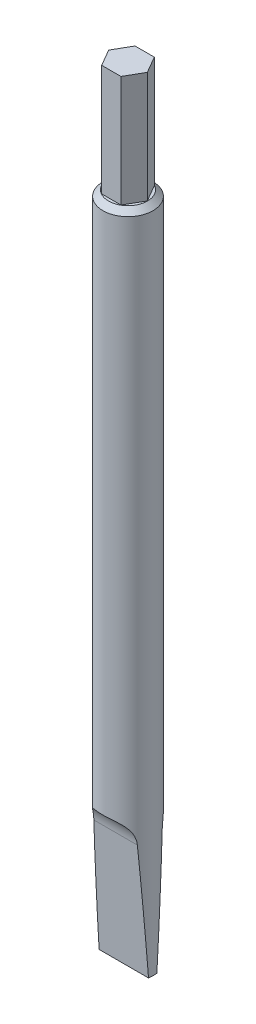
ISO-10303-21;
HEADER;
FILE_DESCRIPTION(('STEP AP214'),'2;1');
FILE_NAME('part.step','',(''),(''),'','','');
FILE_SCHEMA(('AUTOMOTIVE_DESIGN { 1 0 10303 214 1 1 1 1 }'));
ENDSEC;
DATA;
#1=APPLICATION_CONTEXT('core data for automotive mechanical design processes');
#2=APPLICATION_PROTOCOL_DEFINITION('international standard','automotive_design',2000,#1);
#3=PRODUCT_CONTEXT('',#1,'mechanical');
#4=PRODUCT('Part','Part','',(#3));
#5=PRODUCT_RELATED_PRODUCT_CATEGORY('part','',(#4));
#6=PRODUCT_DEFINITION_FORMATION('','',#4);
#7=PRODUCT_DEFINITION_CONTEXT('part definition',#1,'design');
#8=PRODUCT_DEFINITION('design','',#6,#7);
#9=PRODUCT_DEFINITION_SHAPE('','',#8);
#10=(LENGTH_UNIT() NAMED_UNIT(*) SI_UNIT(.MILLI.,.METRE.));
#11=(NAMED_UNIT(*) PLANE_ANGLE_UNIT() SI_UNIT($,.RADIAN.));
#12=(NAMED_UNIT(*) SI_UNIT($,.STERADIAN.) SOLID_ANGLE_UNIT());
#13=UNCERTAINTY_MEASURE_WITH_UNIT(LENGTH_MEASURE(1.E-05),#10,'distance_accuracy_value','');
#14=(GEOMETRIC_REPRESENTATION_CONTEXT(3) GLOBAL_UNCERTAINTY_ASSIGNED_CONTEXT((#13)) GLOBAL_UNIT_ASSIGNED_CONTEXT((#10,
#11,#12)) REPRESENTATION_CONTEXT('',''));
#15=CARTESIAN_POINT('',(0.,0.,0.));
#16=DIRECTION('',(0.,0.,1.));
#17=DIRECTION('',(1.,0.,0.));
#18=AXIS2_PLACEMENT_3D('',#15,#16,#17);
#19=CARTESIAN_POINT('',(-2.59807621135332,20.,-1.5));
#20=DIRECTION('',(-0.866025403784439,0.,-0.5));
#21=DIRECTION('',(-0.5,0.,0.866025403784439));
#22=AXIS2_PLACEMENT_3D('',#19,#20,#21);
#23=PLANE('',#22);
#24=DIRECTION('',(0.5,0.,-0.866025403784439));
#25=VECTOR('',#24,1.);
#26=CARTESIAN_POINT('',(-2.59807621135332,0.,-1.5));
#27=LINE('',#26,#25);
#28=CARTESIAN_POINT('',(-3.46410161513775,0.,0.));
#29=VERTEX_POINT('',#28);
#30=CARTESIAN_POINT('',(-1.73205080756888,0.,-3.));
#31=VERTEX_POINT('',#30);
#32=EDGE_CURVE('E159',#29,#31,#27,.T.);
#33=ORIENTED_EDGE('',*,*,#32,.F.);
#34=DIRECTION('',(0.,-1.,0.));
#35=VECTOR('',#34,1.);
#36=CARTESIAN_POINT('',(-3.46410161513775,20.,0.));
#37=LINE('',#36,#35);
#38=CARTESIAN_POINT('',(-3.46410161513775,20.,0.));
#39=VERTEX_POINT('',#38);
#40=EDGE_CURVE('E185',#39,#29,#37,.T.);
#41=ORIENTED_EDGE('',*,*,#40,.F.);
#42=DIRECTION('',(0.5,0.,-0.866025403784439));
#43=VECTOR('',#42,1.);
#44=CARTESIAN_POINT('',(-2.59807621135332,20.,-1.5));
#45=LINE('',#44,#43);
#46=CARTESIAN_POINT('',(-1.73205080756888,20.,-3.));
#47=VERTEX_POINT('',#46);
#48=EDGE_CURVE('E139',#39,#47,#45,.T.);
#49=ORIENTED_EDGE('',*,*,#48,.T.);
#50=DIRECTION('',(0.,-1.,0.));
#51=VECTOR('',#50,1.);
#52=CARTESIAN_POINT('',(-1.73205080756888,20.,-3.));
#53=LINE('',#52,#51);
#54=EDGE_CURVE('E158',#47,#31,#53,.T.);
#55=ORIENTED_EDGE('',*,*,#54,.T.);
#56=EDGE_LOOP('',(#33,#41,#49,#55));
#57=FACE_BOUND('',#56,.T.);
#58=ADVANCED_FACE('F34',(#57),#23,.T.);
#59=CARTESIAN_POINT('',(-2.59807621135332,20.,1.5));
#60=DIRECTION('',(-0.866025403784439,0.,0.5));
#61=DIRECTION('',(0.5,0.,0.866025403784439));
#62=AXIS2_PLACEMENT_3D('',#59,#60,#61);
#63=PLANE('',#62);
#64=DIRECTION('',(-0.5,0.,-0.866025403784439));
#65=VECTOR('',#64,1.);
#66=CARTESIAN_POINT('',(-2.59807621135332,0.,1.5));
#67=LINE('',#66,#65);
#68=CARTESIAN_POINT('',(-1.73205080756888,0.,3.));
#69=VERTEX_POINT('',#68);
#70=EDGE_CURVE('E162',#69,#29,#67,.T.);
#71=ORIENTED_EDGE('',*,*,#70,.F.);
#72=DIRECTION('',(0.,-1.,0.));
#73=VECTOR('',#72,1.);
#74=CARTESIAN_POINT('',(-1.73205080756888,20.,3.));
#75=LINE('',#74,#73);
#76=CARTESIAN_POINT('',(-1.73205080756888,20.,3.));
#77=VERTEX_POINT('',#76);
#78=EDGE_CURVE('E183',#77,#69,#75,.T.);
#79=ORIENTED_EDGE('',*,*,#78,.F.);
#80=DIRECTION('',(-0.5,0.,-0.866025403784439));
#81=VECTOR('',#80,1.);
#82=CARTESIAN_POINT('',(-2.59807621135332,20.,1.5));
#83=LINE('',#82,#81);
#84=EDGE_CURVE('E142',#77,#39,#83,.T.);
#85=ORIENTED_EDGE('',*,*,#84,.T.);
#86=ORIENTED_EDGE('',*,*,#40,.T.);
#87=EDGE_LOOP('',(#71,#79,#85,#86));
#88=FACE_BOUND('',#87,.T.);
#89=ADVANCED_FACE('F219',(#88),#63,.T.);
#90=CARTESIAN_POINT('',(0.,20.,3.));
#91=DIRECTION('',(0.,0.,1.));
#92=DIRECTION('',(1.,0.,0.));
#93=AXIS2_PLACEMENT_3D('',#90,#91,#92);
#94=PLANE('',#93);
#95=DIRECTION('',(-1.,0.,0.));
#96=VECTOR('',#95,1.);
#97=CARTESIAN_POINT('',(0.,0.,3.));
#98=LINE('',#97,#96);
#99=CARTESIAN_POINT('',(1.73205080756888,0.,3.));
#100=VERTEX_POINT('',#99);
#101=EDGE_CURVE('E165',#100,#69,#98,.T.);
#102=ORIENTED_EDGE('',*,*,#101,.F.);
#103=DIRECTION('',(0.,-1.,0.));
#104=VECTOR('',#103,1.);
#105=CARTESIAN_POINT('',(1.73205080756888,20.,3.));
#106=LINE('',#105,#104);
#107=CARTESIAN_POINT('',(1.73205080756888,20.,3.));
#108=VERTEX_POINT('',#107);
#109=EDGE_CURVE('E181',#108,#100,#106,.T.);
#110=ORIENTED_EDGE('',*,*,#109,.F.);
#111=DIRECTION('',(-1.,0.,0.));
#112=VECTOR('',#111,1.);
#113=CARTESIAN_POINT('',(0.,20.,3.));
#114=LINE('',#113,#112);
#115=EDGE_CURVE('E146',#108,#77,#114,.T.);
#116=ORIENTED_EDGE('',*,*,#115,.T.);
#117=ORIENTED_EDGE('',*,*,#78,.T.);
#118=EDGE_LOOP('',(#102,#110,#116,#117));
#119=FACE_BOUND('',#118,.T.);
#120=ADVANCED_FACE('F224',(#119),#94,.T.);
#121=CARTESIAN_POINT('',(2.59807621135332,20.,1.5));
#122=DIRECTION('',(0.866025403784439,0.,0.5));
#123=DIRECTION('',(0.5,0.,-0.866025403784439));
#124=AXIS2_PLACEMENT_3D('',#121,#122,#123);
#125=PLANE('',#124);
#126=DIRECTION('',(-0.5,0.,0.866025403784439));
#127=VECTOR('',#126,1.);
#128=CARTESIAN_POINT('',(2.59807621135332,0.,1.5));
#129=LINE('',#128,#127);
#130=CARTESIAN_POINT('',(3.46410161513776,0.,0.));
#131=VERTEX_POINT('',#130);
#132=EDGE_CURVE('E168',#131,#100,#129,.T.);
#133=ORIENTED_EDGE('',*,*,#132,.F.);
#134=DIRECTION('',(0.,-1.,0.));
#135=VECTOR('',#134,1.);
#136=CARTESIAN_POINT('',(3.46410161513776,20.,0.));
#137=LINE('',#136,#135);
#138=CARTESIAN_POINT('',(3.46410161513776,20.,0.));
#139=VERTEX_POINT('',#138);
#140=EDGE_CURVE('E179',#139,#131,#137,.T.);
#141=ORIENTED_EDGE('',*,*,#140,.F.);
#142=DIRECTION('',(-0.5,0.,0.866025403784439));
#143=VECTOR('',#142,1.);
#144=CARTESIAN_POINT('',(2.59807621135332,20.,1.5));
#145=LINE('',#144,#143);
#146=EDGE_CURVE('E149',#139,#108,#145,.T.);
#147=ORIENTED_EDGE('',*,*,#146,.T.);
#148=ORIENTED_EDGE('',*,*,#109,.T.);
#149=EDGE_LOOP('',(#133,#141,#147,#148));
#150=FACE_BOUND('',#149,.T.);
#151=ADVANCED_FACE('F230',(#150),#125,.T.);
#152=CARTESIAN_POINT('',(2.59807621135332,20.,-1.5));
#153=DIRECTION('',(0.866025403784439,0.,-0.5));
#154=DIRECTION('',(-0.5,0.,-0.866025403784439));
#155=AXIS2_PLACEMENT_3D('',#152,#153,#154);
#156=PLANE('',#155);
#157=DIRECTION('',(0.5,0.,0.866025403784439));
#158=VECTOR('',#157,1.);
#159=CARTESIAN_POINT('',(2.59807621135332,0.,-1.5));
#160=LINE('',#159,#158);
#161=CARTESIAN_POINT('',(1.73205080756888,0.,-3.));
#162=VERTEX_POINT('',#161);
#163=EDGE_CURVE('E171',#162,#131,#160,.T.);
#164=ORIENTED_EDGE('',*,*,#163,.F.);
#165=DIRECTION('',(0.,-1.,0.));
#166=VECTOR('',#165,1.);
#167=CARTESIAN_POINT('',(1.73205080756888,20.,-3.));
#168=LINE('',#167,#166);
#169=CARTESIAN_POINT('',(1.73205080756888,20.,-3.));
#170=VERTEX_POINT('',#169);
#171=EDGE_CURVE('E177',#170,#162,#168,.T.);
#172=ORIENTED_EDGE('',*,*,#171,.F.);
#173=DIRECTION('',(0.5,0.,0.866025403784439));
#174=VECTOR('',#173,1.);
#175=CARTESIAN_POINT('',(2.59807621135332,20.,-1.5));
#176=LINE('',#175,#174);
#177=EDGE_CURVE('E152',#170,#139,#176,.T.);
#178=ORIENTED_EDGE('',*,*,#177,.T.);
#179=ORIENTED_EDGE('',*,*,#140,.T.);
#180=EDGE_LOOP('',(#164,#172,#178,#179));
#181=FACE_BOUND('',#180,.T.);
#182=ADVANCED_FACE('F234',(#181),#156,.T.);
#183=CARTESIAN_POINT('',(0.,20.,-3.));
#184=DIRECTION('',(0.,0.,-1.));
#185=DIRECTION('',(-1.,0.,0.));
#186=AXIS2_PLACEMENT_3D('',#183,#184,#185);
#187=PLANE('',#186);
#188=DIRECTION('',(1.,0.,0.));
#189=VECTOR('',#188,1.);
#190=CARTESIAN_POINT('',(0.,0.,-3.));
#191=LINE('',#190,#189);
#192=EDGE_CURVE('E143',#31,#162,#191,.T.);
#193=ORIENTED_EDGE('',*,*,#192,.F.);
#194=ORIENTED_EDGE('',*,*,#54,.F.);
#195=DIRECTION('',(1.,0.,0.));
#196=VECTOR('',#195,1.);
#197=CARTESIAN_POINT('',(0.,20.,-3.));
#198=LINE('',#197,#196);
#199=EDGE_CURVE('E155',#47,#170,#198,.T.);
#200=ORIENTED_EDGE('',*,*,#199,.T.);
#201=ORIENTED_EDGE('',*,*,#171,.T.);
#202=EDGE_LOOP('',(#193,#194,#200,#201));
#203=FACE_BOUND('',#202,.T.);
#204=ADVANCED_FACE('F238',(#203),#187,.T.);
#205=CARTESIAN_POINT('',(0.,20.,0.));
#206=DIRECTION('',(0.,1.,0.));
#207=DIRECTION('',(0.,0.,1.));
#208=AXIS2_PLACEMENT_3D('',#205,#206,#207);
#209=PLANE('',#208);
#210=ORIENTED_EDGE('',*,*,#48,.F.);
#211=ORIENTED_EDGE('',*,*,#84,.F.);
#212=ORIENTED_EDGE('',*,*,#115,.F.);
#213=ORIENTED_EDGE('',*,*,#146,.F.);
#214=ORIENTED_EDGE('',*,*,#177,.F.);
#215=ORIENTED_EDGE('',*,*,#199,.F.);
#216=EDGE_LOOP('',(#210,#211,#212,#213,#214,#215));
#217=FACE_BOUND('',#216,.T.);
#218=ADVANCED_FACE('F241',(#217),#209,.T.);
#219=CARTESIAN_POINT('',(0.,-120.,0.));
#220=DIRECTION('',(0.,1.,0.));
#221=DIRECTION('',(0.,0.,1.));
#222=AXIS2_PLACEMENT_3D('',#219,#220,#221);
#223=CYLINDRICAL_SURFACE('',#222,4.5);
#224=CARTESIAN_POINT('',(0.,-130.725499692534,0.));
#225=DIRECTION('',(0.,0.0697564737441253,0.997564050259824));
#226=DIRECTION('',(0.,0.997564050259824,-0.0697564737441253));
#227=AXIS2_PLACEMENT_3D('',#224,#225,#226);
#228=ELLIPSE('',#227,64.5101416179165,4.5);
#229=CARTESIAN_POINT('',(3.90913794443008,-98.8486745427175,-2.22904475760738));
#230=VERTEX_POINT('',#229);
#231=CARTESIAN_POINT('',(4.43705983732471,-120.,-0.75));
#232=VERTEX_POINT('',#231);
#233=EDGE_CURVE('E62',#230,#232,#228,.F.);
#234=ORIENTED_EDGE('',*,*,#233,.F.);
#235=CARTESIAN_POINT('',(0.,-103.394913822876,-4.5));
#236=CARTESIAN_POINT('',(-0.10306936266592,-103.394914042659,-4.49999959992725));
#237=CARTESIAN_POINT('',(-0.206146526435707,-103.39262561122,-4.4964547687701));
#238=CARTESIAN_POINT('',(-0.411646375812195,-103.383423224018,-4.48231641289706));
#239=CARTESIAN_POINT('',(-0.514068786670939,-103.376507440609,-4.471720103098));
#240=CARTESIAN_POINT('',(-0.717671951158907,-103.35789552238,-4.44359339520637));
#241=CARTESIAN_POINT('',(-0.818850709741632,-103.346192534688,-4.42605305791933));
#242=CARTESIAN_POINT('',(-1.01914825963941,-103.317776455429,-4.38426815019586));
#243=CARTESIAN_POINT('',(-1.11826612333103,-103.301061157844,-4.36002062815835));
#244=CARTESIAN_POINT('',(-1.31380152114604,-103.262306170916,-4.30514220860288));
#245=CARTESIAN_POINT('',(-1.41021536260282,-103.240259561821,-4.27450302221005));
#246=CARTESIAN_POINT('',(-1.59943155048244,-103.190529876518,-4.20736148164586));
#247=CARTESIAN_POINT('',(-1.69223560424759,-103.162849504525,-4.17086194222077));
#248=CARTESIAN_POINT('',(-1.87350490130662,-103.101518436916,-4.09264183349529));
#249=CARTESIAN_POINT('',(-1.96197270731229,-103.067871323284,-4.05092440102981));
#250=CARTESIAN_POINT('',(-2.13393666412588,-102.994279950018,-3.96303382328754));
#251=CARTESIAN_POINT('',(-2.21743303962974,-102.954335975283,-3.91686087963604));
#252=CARTESIAN_POINT('',(-2.37646391449519,-102.869174718412,-3.82239737029966));
#253=CARTESIAN_POINT('',(-2.45216008078258,-102.824146396459,-3.7742085918067));
#254=CARTESIAN_POINT('',(-2.59782907350362,-102.727787089095,-3.67546318239444));
#255=CARTESIAN_POINT('',(-2.66779991646161,-102.67645393472,-3.6249057403366));
#256=CARTESIAN_POINT('',(-2.80159661560518,-102.5675311372,-3.52252047999789));
#257=CARTESIAN_POINT('',(-2.86542564006073,-102.509944752787,-3.4706933341963));
#258=CARTESIAN_POINT('',(-2.98679509415638,-102.388614781465,-3.36681443417594));
#259=CARTESIAN_POINT('',(-3.04433320149464,-102.324868937029,-3.31476260433595));
#260=CARTESIAN_POINT('',(-3.15104312227076,-102.193974436802,-3.2134316028522));
#261=CARTESIAN_POINT('',(-3.20044482157957,-102.12703718801,-3.164120869291));
#262=CARTESIAN_POINT('',(-3.29344984525698,-101.988055624931,-3.06719777608168));
#263=CARTESIAN_POINT('',(-3.33705110481997,-101.916009505935,-3.01958602561722));
#264=CARTESIAN_POINT('',(-3.41863105708224,-101.767266878692,-2.92690525303502));
#265=CARTESIAN_POINT('',(-3.45661023014168,-101.690570768536,-2.88183601388489));
#266=CARTESIAN_POINT('',(-3.52724775030424,-101.53297296321,-2.79493487388626));
#267=CARTESIAN_POINT('',(-3.55990413285854,-101.452069729729,-2.75310417130203));
#268=CARTESIAN_POINT('',(-3.62193674409103,-101.28186560832,-2.67102432402607));
#269=CARTESIAN_POINT('',(-3.65101984206145,-101.19234891593,-2.63100129171957));
#270=CARTESIAN_POINT('',(-3.70403304904532,-101.009771882005,-2.55582789107773));
#271=CARTESIAN_POINT('',(-3.72796092597576,-100.916710025942,-2.52067963573714));
#272=CARTESIAN_POINT('',(-3.77106708250027,-100.727657709272,-2.45572257370389));
#273=CARTESIAN_POINT('',(-3.79024470528677,-100.631666845735,-2.42591450554509));
#274=CARTESIAN_POINT('',(-3.82422567164928,-100.437339866016,-2.37198512656214));
#275=CARTESIAN_POINT('',(-3.83902866120977,-100.339003560726,-2.34786427600581));
#276=CARTESIAN_POINT('',(-3.86602211295908,-100.129353034471,-2.30317872247518));
#277=CARTESIAN_POINT('',(-3.87773008241686,-100.017825268037,-2.28332122951155));
#278=CARTESIAN_POINT('',(-3.89646653880555,-99.7932914657789,-2.25119824829132));
#279=CARTESIAN_POINT('',(-3.90349471231471,-99.680285331461,-2.23893326853489));
#280=CARTESIAN_POINT('',(-3.9130860068677,-99.4534613843333,-2.22212780064856));
#281=CARTESIAN_POINT('',(-3.91564714529113,-99.3396432336145,-2.2175907424511));
#282=CARTESIAN_POINT('',(-3.9163777367707,-99.1119495796705,-2.21629990204813));
#283=CARTESIAN_POINT('',(-3.9145471388318,-98.9980740757948,-2.21954621021989));
#284=CARTESIAN_POINT('',(-3.90616454068503,-98.7633117297479,-2.23426894804871));
#285=CARTESIAN_POINT('',(-3.89930286209506,-98.6424692075512,-2.24628494335084));
#286=CARTESIAN_POINT('',(-3.88027386542335,-98.4023790386408,-2.27899802466108));
#287=CARTESIAN_POINT('',(-3.86810624825713,-98.2831314822226,-2.2996956000289));
#288=CARTESIAN_POINT('',(-3.83805987169641,-98.0471146765913,-2.34949827973756));
#289=CARTESIAN_POINT('',(-3.82018035463165,-97.9303457583564,-2.3786044994165));
#290=CARTESIAN_POINT('',(-3.77816410484987,-97.7002408449128,-2.44479279662202));
#291=CARTESIAN_POINT('',(-3.75402763285327,-97.5869047068835,-2.48187454180626));
#292=CARTESIAN_POINT('',(-3.69934686071017,-97.3666734464332,-2.56264818514418));
#293=CARTESIAN_POINT('',(-3.66892797534499,-97.2596983870465,-2.60620662438021));
#294=CARTESIAN_POINT('',(-3.60075344227837,-97.0509444606987,-2.69961396127221));
#295=CARTESIAN_POINT('',(-3.56299779241047,-96.9491655952719,-2.74946286078566));
#296=CARTESIAN_POINT('',(-3.4795386444015,-96.7518689054785,-2.85434660668745));
#297=CARTESIAN_POINT('',(-3.4338437650038,-96.656344444652,-2.90937580002374));
#298=CARTESIAN_POINT('',(-3.33392582192125,-96.4723551385886,-3.02335500686744));
#299=CARTESIAN_POINT('',(-3.27970399095865,-96.3838892756882,-3.08230445292287));
#300=CARTESIAN_POINT('',(-3.16847855957568,-96.2236046087847,-3.19631152006913));
#301=CARTESIAN_POINT('',(-3.11235065569637,-96.151011348599,-3.25113633589698));
#302=CARTESIAN_POINT('',(-2.99288250161521,-96.0125695106198,-3.36143714975031));
#303=CARTESIAN_POINT('',(-2.92954292203065,-95.9467203067732,-3.4169130867981));
#304=CARTESIAN_POINT('',(-2.79578912411157,-95.8220714125836,-3.52719038039958));
#305=CARTESIAN_POINT('',(-2.72537706555095,-95.7632695820909,-3.58199193718989));
#306=CARTESIAN_POINT('',(-2.57778204696853,-95.652802975382,-3.68963122609981));
#307=CARTESIAN_POINT('',(-2.50059939899407,-95.6011378705259,-3.74246904856567));
#308=CARTESIAN_POINT('',(-2.34717040047733,-95.5091957964646,-3.84035365857394));
#309=CARTESIAN_POINT('',(-2.27146003882017,-95.4683131853461,-3.88567430027117));
#310=CARTESIAN_POINT('',(-2.11529480833364,-95.392235956595,-3.9728485832731));
#311=CARTESIAN_POINT('',(-2.03483843928925,-95.3570431508054,-4.01470111814529));
#312=CARTESIAN_POINT('',(-1.86976491901799,-95.2921376723537,-4.09418737623403));
#313=CARTESIAN_POINT('',(-1.78514852365456,-95.262424008776,-4.1318218618108));
#314=CARTESIAN_POINT('',(-1.612292735763,-95.2081830224124,-4.20228834208172));
#315=CARTESIAN_POINT('',(-1.52405196874002,-95.1836576893278,-4.23511849285278));
#316=CARTESIAN_POINT('',(-1.34297373485933,-95.1391247663095,-4.29601076944079));
#317=CARTESIAN_POINT('',(-1.25008227473858,-95.119205847982,-4.32397708815637));
#318=CARTESIAN_POINT('',(-1.0618089991614,-95.0841653046433,-4.37402031006427));
#319=CARTESIAN_POINT('',(-0.966426342269453,-95.0690453238235,-4.39609519434717));
#320=CARTESIAN_POINT('',(-0.773829999084529,-95.0433649599257,-4.43405247530585));
#321=CARTESIAN_POINT('',(-0.676616233801521,-95.0328047740197,-4.44993460419534));
#322=CARTESIAN_POINT('',(-0.480984528316959,-95.0160579191887,-4.47530827628887));
#323=CARTESIAN_POINT('',(-0.382566543780313,-95.009871411783,-4.4847995834803));
#324=CARTESIAN_POINT('',(-0.179786485951292,-95.0015365778041,-4.49761588849472));
#325=CARTESIAN_POINT('',(-0.0753915311063057,-94.9996254651257,-4.50057852937734));
#326=CARTESIAN_POINT('',(0.133298519520584,-95.0004951178538,-4.49923517876633));
#327=CARTESIAN_POINT('',(0.237593636135597,-95.0032744409985,-4.49493142161666));
#328=CARTESIAN_POINT('',(0.445460657930005,-95.0135840572233,-4.47911096934639));
#329=CARTESIAN_POINT('',(0.549032116626977,-95.021117059519,-4.46759016111323));
#330=CARTESIAN_POINT('',(0.754625845668999,-95.0410874084281,-4.43749130505874));
#331=CARTESIAN_POINT('',(0.85664870076627,-95.0535228534982,-4.41891599361706));
#332=CARTESIAN_POINT('',(1.0599452591657,-95.0837602785432,-4.37464243756216));
#333=CARTESIAN_POINT('',(1.16118558801732,-95.1016388796568,-4.34884294710625));
#334=CARTESIAN_POINT('',(1.36053785732162,-95.143007132598,-4.29065419495016));
#335=CARTESIAN_POINT('',(1.4586510167648,-95.1664945669813,-4.25826753822516));
#336=CARTESIAN_POINT('',(1.65098719675729,-95.2194423919958,-4.18745032243503));
#337=CARTESIAN_POINT('',(1.74521105913888,-95.2489014818249,-4.14902108003088));
#338=CARTESIAN_POINT('',(1.92901767855529,-95.3141635141517,-4.06681991059832));
#339=CARTESIAN_POINT('',(2.01860068178558,-95.3499661196824,-4.02304826739611));
#340=CARTESIAN_POINT('',(2.18891848545435,-95.4266740694933,-3.93288020236322));
#341=CARTESIAN_POINT('',(2.2698639349505,-95.4673177649193,-3.88665900252025));
#342=CARTESIAN_POINT('',(2.42626213602198,-95.5549803520154,-3.7909968849564));
#343=CARTESIAN_POINT('',(2.50171301535406,-95.6020014012548,-3.7415548805363));
#344=CARTESIAN_POINT('',(2.6465603501795,-95.702468121423,-3.64053705577671));
#345=CARTESIAN_POINT('',(2.71596145605915,-95.7559087811698,-3.58896292015318));
#346=CARTESIAN_POINT('',(2.84846407594618,-95.8692271728095,-3.48473261347844));
#347=CARTESIAN_POINT('',(2.9115633254975,-95.9291072026349,-3.43207606161788));
#348=CARTESIAN_POINT('',(3.02840560019252,-96.0520982713689,-3.32934266894435));
#349=CARTESIAN_POINT('',(3.08245105089515,-96.1149197416818,-3.279262367911));
#350=CARTESIAN_POINT('',(3.18465150256469,-96.2459623576308,-3.18010490670165));
#351=CARTESIAN_POINT('',(3.2328044141022,-96.3141854045645,-3.13102810746446));
#352=CARTESIAN_POINT('',(3.32330769017292,-96.455629179409,-3.03479657993718));
#353=CARTESIAN_POINT('',(3.36565874341878,-96.5288493125893,-2.98764162398132));
#354=CARTESIAN_POINT('',(3.44480286097593,-96.6798778646988,-2.89603178121557));
#355=CARTESIAN_POINT('',(3.48159386714151,-96.7576879679374,-2.85157789787666));
#356=CARTESIAN_POINT('',(3.55117195899448,-96.9203591953557,-2.76448915105965));
#357=CARTESIAN_POINT('',(3.58375903483151,-97.0053749690324,-2.72198358712843));
#358=CARTESIAN_POINT('',(3.64365535207881,-97.1792604539378,-2.64126927684477));
#359=CARTESIAN_POINT('',(3.67096233171435,-97.2681317968633,-2.60306237477842));
#360=CARTESIAN_POINT('',(3.72068770710742,-97.4491359280306,-2.53147847510348));
#361=CARTESIAN_POINT('',(3.7431055218269,-97.5412691024043,-2.49810205171693));
#362=CARTESIAN_POINT('',(3.78343773102361,-97.7282323184804,-2.43658605030686));
#363=CARTESIAN_POINT('',(3.80135173551183,-97.8230625929364,-2.40844692584055));
#364=CARTESIAN_POINT('',(3.83477673953585,-98.0254867373077,-2.35490834516232));
#365=CARTESIAN_POINT('',(3.84980292215978,-98.133332373753,-2.33015598307202));
#366=CARTESIAN_POINT('',(3.8751268789566,-98.3509645219762,-2.28779373167289));
#367=CARTESIAN_POINT('',(3.88542435170477,-98.4607511570171,-2.27018429768795));
#368=CARTESIAN_POINT('',(3.90158383710484,-98.6816216375681,-2.24229877350857));
#369=CARTESIAN_POINT('',(3.90744396683306,-98.7927060134768,-2.23202579654082));
#370=CARTESIAN_POINT('',(3.91489365328974,-99.0154551962107,-2.21893299425275));
#371=CARTESIAN_POINT('',(3.91648310020698,-99.1271200178867,-2.21611336057883));
#372=CARTESIAN_POINT('',(3.91539728764423,-99.3594436977743,-2.21803256126074));
#373=CARTESIAN_POINT('',(3.9123651171463,-99.4800963396138,-2.22340397701398));
#374=CARTESIAN_POINT('',(3.90125936585208,-99.72047362617,-2.24283296683422));
#375=CARTESIAN_POINT('',(3.89318547551101,-99.8401982134501,-2.25689107423454));
#376=CARTESIAN_POINT('',(3.87171813877948,-100.077894459356,-2.29352339709343));
#377=CARTESIAN_POINT('',(3.85832316253468,-100.195865603725,-2.31610006161091));
#378=CARTESIAN_POINT('',(3.82578291934198,-100.429130513123,-2.36946433582909));
#379=CARTESIAN_POINT('',(3.80663778801854,-100.54442434123,-2.4002517518672));
#380=CARTESIAN_POINT('',(3.7620496975664,-100.771324533996,-2.46955006626118));
#381=CARTESIAN_POINT('',(3.73661164235395,-100.882933693624,-2.50805494617903));
#382=CARTESIAN_POINT('',(3.67876997677111,-101.10159785216,-2.59215244599292));
#383=CARTESIAN_POINT('',(3.6463662541399,-101.208652777638,-2.63774518011571));
#384=CARTESIAN_POINT('',(3.57392775310523,-101.417121358701,-2.73508968205931));
#385=CARTESIAN_POINT('',(3.53389992732525,-101.518540046106,-2.78683582239679));
#386=CARTESIAN_POINT('',(3.44553518086047,-101.714850708547,-2.89537198598193));
#387=CARTESIAN_POINT('',(3.39719938041717,-101.80974356111,-2.95216132870937));
#388=CARTESIAN_POINT('',(3.29650209378108,-101.983775221334,-3.0640179282577));
#389=CARTESIAN_POINT('',(3.24490917812608,-102.063561604968,-3.11877030223438));
#390=CARTESIAN_POINT('',(3.1341819991453,-102.216403021385,-3.23002452467441));
#391=CARTESIAN_POINT('',(3.07504820853457,-102.289458475617,-3.28652626330732));
#392=CARTESIAN_POINT('',(2.94923741426048,-102.428344036006,-3.39987656193119));
#393=CARTESIAN_POINT('',(2.88256539788752,-102.494178863178,-3.456724869347));
#394=CARTESIAN_POINT('',(2.74182760560025,-102.618409132379,-3.56938382220619));
#395=CARTESIAN_POINT('',(2.66776238592739,-102.676805133331,-3.62519454533994));
#396=CARTESIAN_POINT('',(2.52073395305716,-102.780391407808,-3.72868896674238));
#397=CARTESIAN_POINT('',(2.44846069234165,-102.826323719211,-3.77661337954505));
#398=CARTESIAN_POINT('',(2.29869197722806,-102.912266607234,-3.86959754692047));
#399=CARTESIAN_POINT('',(2.22119473433065,-102.952275140632,-3.91465631003384));
#400=CARTESIAN_POINT('',(2.06149289386498,-103.026537112772,-4.00106138832032));
#401=CARTESIAN_POINT('',(1.97928722568424,-103.060789235588,-4.04240685362293));
#402=CARTESIAN_POINT('',(1.81072524154554,-103.123790491803,-4.12066888409275));
#403=CARTESIAN_POINT('',(1.72436743323537,-103.152537627834,-4.15758383993671));
#404=CARTESIAN_POINT('',(1.54817364969391,-103.204791578248,-4.2263576473003));
#405=CARTESIAN_POINT('',(1.45833913474361,-103.228300565307,-4.25821859353264));
#406=CARTESIAN_POINT('',(1.27573849578266,-103.270397304679,-4.31644288739901));
#407=CARTESIAN_POINT('',(1.18297107780873,-103.28898284993,-4.34280376836462));
#408=CARTESIAN_POINT('',(0.995331853000276,-103.321462475154,-4.38960691636672));
#409=CARTESIAN_POINT('',(0.900464034629995,-103.335364749555,-4.4100595122374));
#410=CARTESIAN_POINT('',(0.709077330364148,-103.358749809845,-4.44484740959929));
#411=CARTESIAN_POINT('',(0.612558468929965,-103.368232661152,-4.45918280163975));
#412=CARTESIAN_POINT('',(0.430138417632066,-103.382060878757,-4.48021987851918));
#413=CARTESIAN_POINT('',(0.344354315724629,-103.386886494759,-4.48763162485993));
#414=CARTESIAN_POINT('',(0.172381964724777,-103.393312896668,-4.49752188615395));
#415=CARTESIAN_POINT('',(0.0861937101969903,-103.394913639079,-4.50000033456842));
#416=CARTESIAN_POINT('',(0.,-103.394913822876,-4.5));
#417=B_SPLINE_CURVE_WITH_KNOTS('',3,(#235,#236,#237,#238,#239,#240,#241,#242,#243,#244,#245,
#246,#247,#248,#249,#250,#251,#252,#253,#254,#255,#256,#257,#258,#259,#260,#261,#262,#263,#264,
#265,#266,#267,#268,#269,#270,#271,#272,#273,#274,#275,#276,#277,#278,#279,#280,#281,#282,#283,
#284,#285,#286,#287,#288,#289,#290,#291,#292,#293,#294,#295,#296,#297,#298,#299,#300,#301,#302,
#303,#304,#305,#306,#307,#308,#309,#310,#311,#312,#313,#314,#315,#316,#317,#318,#319,#320,#321,
#322,#323,#324,#325,#326,#327,#328,#329,#330,#331,#332,#333,#334,#335,#336,#337,#338,#339,#340,
#341,#342,#343,#344,#345,#346,#347,#348,#349,#350,#351,#352,#353,#354,#355,#356,#357,#358,#359,
#360,#361,#362,#363,#364,#365,#366,#367,#368,#369,#370,#371,#372,#373,#374,#375,#376,#377,#378,
#379,#380,#381,#382,#383,#384,#385,#386,#387,#388,#389,#390,#391,#392,#393,#394,#395,#396,#397,
#398,#399,#400,#401,#402,#403,#404,#405,#406,#407,#408,#409,#410,#411,#412,#413,#414,#415,#416),
.UNSPECIFIED.,.T.,.F.,(4,2,2,2,2,2,2,2,2,2,2,2,2,2,2,2,2,2,2,2,2,2,2,2,2,2,2,2,2,2,2,2,2,2,2,2,
2,2,2,2,2,2,2,2,2,2,2,2,2,2,2,2,2,2,2,2,2,2,2,2,2,2,2,2,2,2,2,2,2,2,2,2,2,2,2,2,2,2,2,2,2,2,2,2,
2,2,2,2,2,2,4),(0.,0.309135188173814,0.618392546272515,0.928094163427261,1.23793228701994,
1.54817474269628,1.85826863124839,2.16817698902176,2.47807132908076,2.77887922218727,
3.07979088952097,3.38054648928669,3.6814127412397,3.97121245448033,4.26111505440171,
4.5509928702607,4.84097743386234,5.14749365790789,5.45414233035826,5.76083337883215,
6.06754923936986,6.40883423722348,6.75014208978915,7.09160138774842,7.43306465061252,
7.79752512639486,8.16200614869635,8.52653553864846,8.89104974150308,9.24888991183921,
9.60673018784046,9.96418439614725,10.3215869755262,10.6418214865776,10.962026243148,
11.2821335120661,11.6022260354158,11.8936321507267,12.1851308784469,12.4765768361292,
12.768134360216,13.0649078374308,13.3617828844206,13.6586707674178,13.9555696138635,
14.2685711441518,14.5814764471599,14.8945602423356,15.2075227188969,15.5251120490114,
15.8425760279047,16.1599709279816,16.4773489731256,16.7820217341371,17.0867978295391,
17.3913375424985,17.6959862954214,17.9861303984152,18.2763770870123,18.566589291813,
18.8569086618276,19.1580344208089,19.4592888852293,19.760579131842,20.0618954584722,
20.3965333004206,20.7311924704105,21.0659935688239,21.4008032758302,21.7628096678086,
22.1248382879571,22.4869710696215,22.8490953106096,23.2109382414058,23.572787004211,
23.9343073537808,24.2957789943858,24.6243013724936,24.9528031666227,25.281088881857,
25.6093499164928,25.9033922283665,26.1975357258825,26.4917463740052,26.7860635688316,
27.0802584587954,27.374585006972,27.6683938572323,27.9621983582681,28.2207150382285,
28.4792352049584),.UNSPECIFIED.);
#418=CARTESIAN_POINT('',(-3.90913794443008,-98.8486745427175,-2.22904475760738));
#419=VERTEX_POINT('',#418);
#420=EDGE_CURVE('E11',#419,#230,#417,.T.);
#421=ORIENTED_EDGE('',*,*,#420,.F.);
#422=CARTESIAN_POINT('',(-4.43705983732471,-120.,-0.75));
#423=VERTEX_POINT('',#422);
#424=EDGE_CURVE('E132',#423,#419,#228,.F.);
#425=ORIENTED_EDGE('',*,*,#424,.F.);
#426=CARTESIAN_POINT('',(0.,-120.,0.));
#427=DIRECTION('',(0.,1.,0.));
#428=DIRECTION('',(0.,0.,1.));
#429=AXIS2_PLACEMENT_3D('',#426,#427,#428);
#430=CIRCLE('',#429,4.5);
#431=CARTESIAN_POINT('',(-4.43705983732471,-120.,0.75));
#432=VERTEX_POINT('',#431);
#433=EDGE_CURVE('E131',#423,#432,#430,.T.);
#434=ORIENTED_EDGE('',*,*,#433,.T.);
#435=CARTESIAN_POINT('',(0.,-130.725499692534,0.));
#436=DIRECTION('',(0.,0.0697564737441253,-0.997564050259824));
#437=DIRECTION('',(0.,0.997564050259824,0.0697564737441253));
#438=AXIS2_PLACEMENT_3D('',#435,#436,#437);
#439=ELLIPSE('',#438,64.5101416179165,4.5);
#440=CARTESIAN_POINT('',(-3.90913794443008,-98.8486745427175,2.22904475760738));
#441=VERTEX_POINT('',#440);
#442=EDGE_CURVE('E54',#441,#432,#439,.F.);
#443=ORIENTED_EDGE('',*,*,#442,.F.);
#444=CARTESIAN_POINT('',(0.,-103.394913822876,4.5));
#445=CARTESIAN_POINT('',(0.10306936266592,-103.394914042659,4.49999959992725));
#446=CARTESIAN_POINT('',(0.206146526435707,-103.39262561122,4.4964547687701));
#447=CARTESIAN_POINT('',(0.411646375812195,-103.383423224018,4.48231641289706));
#448=CARTESIAN_POINT('',(0.514068786670939,-103.376507440609,4.471720103098));
#449=CARTESIAN_POINT('',(0.717671951158907,-103.35789552238,4.44359339520637));
#450=CARTESIAN_POINT('',(0.818850709741632,-103.346192534688,4.42605305791933));
#451=CARTESIAN_POINT('',(1.01914825963941,-103.317776455429,4.38426815019586));
#452=CARTESIAN_POINT('',(1.11826612333103,-103.301061157844,4.36002062815835));
#453=CARTESIAN_POINT('',(1.31380152114604,-103.262306170916,4.30514220860288));
#454=CARTESIAN_POINT('',(1.41021536260282,-103.240259561821,4.27450302221005));
#455=CARTESIAN_POINT('',(1.59943155048244,-103.190529876518,4.20736148164586));
#456=CARTESIAN_POINT('',(1.69223560424759,-103.162849504525,4.17086194222077));
#457=CARTESIAN_POINT('',(1.87350490130662,-103.101518436916,4.09264183349529));
#458=CARTESIAN_POINT('',(1.96197270731229,-103.067871323284,4.05092440102981));
#459=CARTESIAN_POINT('',(2.13393666412588,-102.994279950018,3.96303382328754));
#460=CARTESIAN_POINT('',(2.21743303962974,-102.954335975283,3.91686087963604));
#461=CARTESIAN_POINT('',(2.37646391449519,-102.869174718412,3.82239737029966));
#462=CARTESIAN_POINT('',(2.45216008078258,-102.824146396459,3.7742085918067));
#463=CARTESIAN_POINT('',(2.59782907350362,-102.727787089095,3.67546318239444));
#464=CARTESIAN_POINT('',(2.66779991646161,-102.67645393472,3.6249057403366));
#465=CARTESIAN_POINT('',(2.80159661560518,-102.5675311372,3.52252047999789));
#466=CARTESIAN_POINT('',(2.86542564006073,-102.509944752787,3.4706933341963));
#467=CARTESIAN_POINT('',(2.98679509415638,-102.388614781465,3.36681443417594));
#468=CARTESIAN_POINT('',(3.04433320149464,-102.324868937029,3.31476260433595));
#469=CARTESIAN_POINT('',(3.15104312227076,-102.193974436802,3.2134316028522));
#470=CARTESIAN_POINT('',(3.20044482157957,-102.12703718801,3.164120869291));
#471=CARTESIAN_POINT('',(3.29344984525698,-101.988055624931,3.06719777608168));
#472=CARTESIAN_POINT('',(3.33705110481997,-101.916009505935,3.01958602561722));
#473=CARTESIAN_POINT('',(3.41863105708224,-101.767266878692,2.92690525303502));
#474=CARTESIAN_POINT('',(3.45661023014168,-101.690570768536,2.88183601388489));
#475=CARTESIAN_POINT('',(3.52724775030424,-101.53297296321,2.79493487388626));
#476=CARTESIAN_POINT('',(3.55990413285854,-101.452069729729,2.75310417130203));
#477=CARTESIAN_POINT('',(3.62193674409103,-101.28186560832,2.67102432402607));
#478=CARTESIAN_POINT('',(3.65101984206145,-101.19234891593,2.63100129171957));
#479=CARTESIAN_POINT('',(3.70403304904532,-101.009771882005,2.55582789107773));
#480=CARTESIAN_POINT('',(3.72796092597576,-100.916710025942,2.52067963573714));
#481=CARTESIAN_POINT('',(3.77106708250027,-100.727657709272,2.45572257370389));
#482=CARTESIAN_POINT('',(3.79024470528677,-100.631666845735,2.42591450554509));
#483=CARTESIAN_POINT('',(3.82422567164928,-100.437339866016,2.37198512656214));
#484=CARTESIAN_POINT('',(3.83902866120977,-100.339003560726,2.34786427600581));
#485=CARTESIAN_POINT('',(3.86602211295908,-100.129353034471,2.30317872247518));
#486=CARTESIAN_POINT('',(3.87773008241686,-100.017825268037,2.28332122951155));
#487=CARTESIAN_POINT('',(3.89646653880555,-99.7932914657789,2.25119824829132));
#488=CARTESIAN_POINT('',(3.90349471231471,-99.680285331461,2.23893326853489));
#489=CARTESIAN_POINT('',(3.9130860068677,-99.4534613843333,2.22212780064856));
#490=CARTESIAN_POINT('',(3.91564714529113,-99.3396432336145,2.2175907424511));
#491=CARTESIAN_POINT('',(3.9163777367707,-99.1119495796705,2.21629990204813));
#492=CARTESIAN_POINT('',(3.9145471388318,-98.9980740757948,2.21954621021989));
#493=CARTESIAN_POINT('',(3.90616454068503,-98.7633117297479,2.23426894804871));
#494=CARTESIAN_POINT('',(3.89930286209506,-98.6424692075512,2.24628494335084));
#495=CARTESIAN_POINT('',(3.88027386542335,-98.4023790386408,2.27899802466108));
#496=CARTESIAN_POINT('',(3.86810624825713,-98.2831314822226,2.2996956000289));
#497=CARTESIAN_POINT('',(3.83805987169641,-98.0471146765913,2.34949827973756));
#498=CARTESIAN_POINT('',(3.82018035463165,-97.9303457583564,2.3786044994165));
#499=CARTESIAN_POINT('',(3.77816410484987,-97.7002408449128,2.44479279662202));
#500=CARTESIAN_POINT('',(3.75402763285327,-97.5869047068835,2.48187454180626));
#501=CARTESIAN_POINT('',(3.69934686071017,-97.3666734464332,2.56264818514418));
#502=CARTESIAN_POINT('',(3.66892797534499,-97.2596983870465,2.60620662438021));
#503=CARTESIAN_POINT('',(3.60075344227837,-97.0509444606987,2.69961396127221));
#504=CARTESIAN_POINT('',(3.56299779241047,-96.9491655952719,2.74946286078566));
#505=CARTESIAN_POINT('',(3.4795386444015,-96.7518689054785,2.85434660668745));
#506=CARTESIAN_POINT('',(3.4338437650038,-96.656344444652,2.90937580002374));
#507=CARTESIAN_POINT('',(3.33392582192125,-96.4723551385886,3.02335500686744));
#508=CARTESIAN_POINT('',(3.27970399095865,-96.3838892756882,3.08230445292287));
#509=CARTESIAN_POINT('',(3.16847855957568,-96.2236046087847,3.19631152006913));
#510=CARTESIAN_POINT('',(3.11235065569637,-96.151011348599,3.25113633589698));
#511=CARTESIAN_POINT('',(2.99288250161521,-96.0125695106198,3.36143714975031));
#512=CARTESIAN_POINT('',(2.92954292203065,-95.9467203067732,3.4169130867981));
#513=CARTESIAN_POINT('',(2.79578912411157,-95.8220714125836,3.52719038039958));
#514=CARTESIAN_POINT('',(2.72537706555095,-95.7632695820909,3.58199193718989));
#515=CARTESIAN_POINT('',(2.57778204696853,-95.652802975382,3.68963122609981));
#516=CARTESIAN_POINT('',(2.50059939899407,-95.6011378705259,3.74246904856567));
#517=CARTESIAN_POINT('',(2.34717040047733,-95.5091957964646,3.84035365857394));
#518=CARTESIAN_POINT('',(2.27146003882017,-95.4683131853461,3.88567430027117));
#519=CARTESIAN_POINT('',(2.11529480833364,-95.392235956595,3.9728485832731));
#520=CARTESIAN_POINT('',(2.03483843928925,-95.3570431508054,4.01470111814529));
#521=CARTESIAN_POINT('',(1.86976491901799,-95.2921376723537,4.09418737623403));
#522=CARTESIAN_POINT('',(1.78514852365456,-95.262424008776,4.1318218618108));
#523=CARTESIAN_POINT('',(1.612292735763,-95.2081830224124,4.20228834208172));
#524=CARTESIAN_POINT('',(1.52405196874002,-95.1836576893278,4.23511849285278));
#525=CARTESIAN_POINT('',(1.34297373485933,-95.1391247663095,4.29601076944079));
#526=CARTESIAN_POINT('',(1.25008227473858,-95.119205847982,4.32397708815637));
#527=CARTESIAN_POINT('',(1.0618089991614,-95.0841653046433,4.37402031006427));
#528=CARTESIAN_POINT('',(0.966426342269453,-95.0690453238235,4.39609519434717));
#529=CARTESIAN_POINT('',(0.773829999084529,-95.0433649599257,4.43405247530585));
#530=CARTESIAN_POINT('',(0.676616233801521,-95.0328047740197,4.44993460419534));
#531=CARTESIAN_POINT('',(0.480984528316959,-95.0160579191887,4.47530827628887));
#532=CARTESIAN_POINT('',(0.382566543780313,-95.009871411783,4.4847995834803));
#533=CARTESIAN_POINT('',(0.179786485951292,-95.0015365778041,4.49761588849472));
#534=CARTESIAN_POINT('',(0.0753915311063057,-94.9996254651257,4.50057852937734));
#535=CARTESIAN_POINT('',(-0.133298519520584,-95.0004951178538,4.49923517876633));
#536=CARTESIAN_POINT('',(-0.237593636135597,-95.0032744409985,4.49493142161666));
#537=CARTESIAN_POINT('',(-0.445460657930005,-95.0135840572233,4.47911096934639));
#538=CARTESIAN_POINT('',(-0.549032116626977,-95.021117059519,4.46759016111323));
#539=CARTESIAN_POINT('',(-0.754625845668999,-95.0410874084281,4.43749130505874));
#540=CARTESIAN_POINT('',(-0.85664870076627,-95.0535228534982,4.41891599361706));
#541=CARTESIAN_POINT('',(-1.0599452591657,-95.0837602785432,4.37464243756216));
#542=CARTESIAN_POINT('',(-1.16118558801732,-95.1016388796568,4.34884294710625));
#543=CARTESIAN_POINT('',(-1.36053785732162,-95.143007132598,4.29065419495016));
#544=CARTESIAN_POINT('',(-1.4586510167648,-95.1664945669813,4.25826753822516));
#545=CARTESIAN_POINT('',(-1.65098719675729,-95.2194423919958,4.18745032243503));
#546=CARTESIAN_POINT('',(-1.74521105913888,-95.2489014818249,4.14902108003088));
#547=CARTESIAN_POINT('',(-1.92901767855529,-95.3141635141517,4.06681991059832));
#548=CARTESIAN_POINT('',(-2.01860068178558,-95.3499661196824,4.02304826739611));
#549=CARTESIAN_POINT('',(-2.18891848545435,-95.4266740694933,3.93288020236322));
#550=CARTESIAN_POINT('',(-2.2698639349505,-95.4673177649193,3.88665900252025));
#551=CARTESIAN_POINT('',(-2.42626213602198,-95.5549803520154,3.7909968849564));
#552=CARTESIAN_POINT('',(-2.50171301535406,-95.6020014012548,3.7415548805363));
#553=CARTESIAN_POINT('',(-2.6465603501795,-95.702468121423,3.64053705577671));
#554=CARTESIAN_POINT('',(-2.71596145605915,-95.7559087811698,3.58896292015318));
#555=CARTESIAN_POINT('',(-2.84846407594618,-95.8692271728095,3.48473261347844));
#556=CARTESIAN_POINT('',(-2.9115633254975,-95.9291072026349,3.43207606161788));
#557=CARTESIAN_POINT('',(-3.02840560019252,-96.0520982713689,3.32934266894435));
#558=CARTESIAN_POINT('',(-3.08245105089515,-96.1149197416818,3.279262367911));
#559=CARTESIAN_POINT('',(-3.18465150256469,-96.2459623576308,3.18010490670165));
#560=CARTESIAN_POINT('',(-3.2328044141022,-96.3141854045645,3.13102810746446));
#561=CARTESIAN_POINT('',(-3.32330769017292,-96.455629179409,3.03479657993718));
#562=CARTESIAN_POINT('',(-3.36565874341878,-96.5288493125893,2.98764162398132));
#563=CARTESIAN_POINT('',(-3.44480286097593,-96.6798778646988,2.89603178121557));
#564=CARTESIAN_POINT('',(-3.48159386714151,-96.7576879679374,2.85157789787666));
#565=CARTESIAN_POINT('',(-3.55117195899448,-96.9203591953557,2.76448915105965));
#566=CARTESIAN_POINT('',(-3.58375903483151,-97.0053749690324,2.72198358712843));
#567=CARTESIAN_POINT('',(-3.64365535207881,-97.1792604539378,2.64126927684477));
#568=CARTESIAN_POINT('',(-3.67096233171435,-97.2681317968633,2.60306237477842));
#569=CARTESIAN_POINT('',(-3.72068770710742,-97.4491359280306,2.53147847510348));
#570=CARTESIAN_POINT('',(-3.7431055218269,-97.5412691024043,2.49810205171693));
#571=CARTESIAN_POINT('',(-3.78343773102361,-97.7282323184804,2.43658605030686));
#572=CARTESIAN_POINT('',(-3.80135173551183,-97.8230625929364,2.40844692584055));
#573=CARTESIAN_POINT('',(-3.83477673953585,-98.0254867373077,2.35490834516232));
#574=CARTESIAN_POINT('',(-3.84980292215978,-98.133332373753,2.33015598307202));
#575=CARTESIAN_POINT('',(-3.8751268789566,-98.3509645219762,2.28779373167289));
#576=CARTESIAN_POINT('',(-3.88542435170477,-98.4607511570171,2.27018429768795));
#577=CARTESIAN_POINT('',(-3.90158383710484,-98.6816216375681,2.24229877350857));
#578=CARTESIAN_POINT('',(-3.90744396683306,-98.7927060134768,2.23202579654082));
#579=CARTESIAN_POINT('',(-3.91489365328974,-99.0154551962107,2.21893299425275));
#580=CARTESIAN_POINT('',(-3.91648310020698,-99.1271200178867,2.21611336057883));
#581=CARTESIAN_POINT('',(-3.91539728764423,-99.3594436977743,2.21803256126074));
#582=CARTESIAN_POINT('',(-3.9123651171463,-99.4800963396138,2.22340397701398));
#583=CARTESIAN_POINT('',(-3.90125936585208,-99.72047362617,2.24283296683422));
#584=CARTESIAN_POINT('',(-3.89318547551101,-99.8401982134501,2.25689107423454));
#585=CARTESIAN_POINT('',(-3.87171813877948,-100.077894459356,2.29352339709343));
#586=CARTESIAN_POINT('',(-3.85832316253468,-100.195865603725,2.31610006161091));
#587=CARTESIAN_POINT('',(-3.82578291934198,-100.429130513123,2.36946433582909));
#588=CARTESIAN_POINT('',(-3.80663778801854,-100.54442434123,2.4002517518672));
#589=CARTESIAN_POINT('',(-3.7620496975664,-100.771324533996,2.46955006626118));
#590=CARTESIAN_POINT('',(-3.73661164235395,-100.882933693624,2.50805494617903));
#591=CARTESIAN_POINT('',(-3.67876997677111,-101.10159785216,2.59215244599292));
#592=CARTESIAN_POINT('',(-3.6463662541399,-101.208652777638,2.63774518011571));
#593=CARTESIAN_POINT('',(-3.57392775310523,-101.417121358701,2.73508968205931));
#594=CARTESIAN_POINT('',(-3.53389992732525,-101.518540046106,2.78683582239679));
#595=CARTESIAN_POINT('',(-3.44553518086047,-101.714850708547,2.89537198598193));
#596=CARTESIAN_POINT('',(-3.39719938041717,-101.80974356111,2.95216132870937));
#597=CARTESIAN_POINT('',(-3.29650209378108,-101.983775221334,3.0640179282577));
#598=CARTESIAN_POINT('',(-3.24490917812608,-102.063561604968,3.11877030223438));
#599=CARTESIAN_POINT('',(-3.1341819991453,-102.216403021385,3.23002452467441));
#600=CARTESIAN_POINT('',(-3.07504820853457,-102.289458475617,3.28652626330732));
#601=CARTESIAN_POINT('',(-2.94923741426048,-102.428344036006,3.39987656193119));
#602=CARTESIAN_POINT('',(-2.88256539788752,-102.494178863178,3.456724869347));
#603=CARTESIAN_POINT('',(-2.74182760560025,-102.618409132379,3.56938382220619));
#604=CARTESIAN_POINT('',(-2.66776238592739,-102.676805133331,3.62519454533994));
#605=CARTESIAN_POINT('',(-2.52073395305716,-102.780391407808,3.72868896674238));
#606=CARTESIAN_POINT('',(-2.44846069234165,-102.826323719211,3.77661337954505));
#607=CARTESIAN_POINT('',(-2.29869197722806,-102.912266607234,3.86959754692047));
#608=CARTESIAN_POINT('',(-2.22119473433065,-102.952275140632,3.91465631003384));
#609=CARTESIAN_POINT('',(-2.06149289386498,-103.026537112772,4.00106138832032));
#610=CARTESIAN_POINT('',(-1.97928722568424,-103.060789235588,4.04240685362293));
#611=CARTESIAN_POINT('',(-1.81072524154554,-103.123790491803,4.12066888409275));
#612=CARTESIAN_POINT('',(-1.72436743323537,-103.152537627834,4.15758383993671));
#613=CARTESIAN_POINT('',(-1.54817364969391,-103.204791578248,4.2263576473003));
#614=CARTESIAN_POINT('',(-1.45833913474361,-103.228300565307,4.25821859353264));
#615=CARTESIAN_POINT('',(-1.27573849578266,-103.270397304679,4.31644288739901));
#616=CARTESIAN_POINT('',(-1.18297107780873,-103.28898284993,4.34280376836462));
#617=CARTESIAN_POINT('',(-0.995331853000276,-103.321462475154,4.38960691636672));
#618=CARTESIAN_POINT('',(-0.900464034629995,-103.335364749555,4.4100595122374));
#619=CARTESIAN_POINT('',(-0.709077330364148,-103.358749809845,4.44484740959929));
#620=CARTESIAN_POINT('',(-0.612558468929965,-103.368232661152,4.45918280163975));
#621=CARTESIAN_POINT('',(-0.430138417632066,-103.382060878757,4.48021987851918));
#622=CARTESIAN_POINT('',(-0.344354315724629,-103.386886494759,4.48763162485993));
#623=CARTESIAN_POINT('',(-0.172381964724777,-103.393312896668,4.49752188615395));
#624=CARTESIAN_POINT('',(-0.0861937101969903,-103.394913639079,4.50000033456842));
#625=CARTESIAN_POINT('',(0.,-103.394913822876,4.5));
#626=B_SPLINE_CURVE_WITH_KNOTS('',3,(#444,#445,#446,#447,#448,#449,#450,#451,#452,#453,#454,
#455,#456,#457,#458,#459,#460,#461,#462,#463,#464,#465,#466,#467,#468,#469,#470,#471,#472,#473,
#474,#475,#476,#477,#478,#479,#480,#481,#482,#483,#484,#485,#486,#487,#488,#489,#490,#491,#492,
#493,#494,#495,#496,#497,#498,#499,#500,#501,#502,#503,#504,#505,#506,#507,#508,#509,#510,#511,
#512,#513,#514,#515,#516,#517,#518,#519,#520,#521,#522,#523,#524,#525,#526,#527,#528,#529,#530,
#531,#532,#533,#534,#535,#536,#537,#538,#539,#540,#541,#542,#543,#544,#545,#546,#547,#548,#549,
#550,#551,#552,#553,#554,#555,#556,#557,#558,#559,#560,#561,#562,#563,#564,#565,#566,#567,#568,
#569,#570,#571,#572,#573,#574,#575,#576,#577,#578,#579,#580,#581,#582,#583,#584,#585,#586,#587,
#588,#589,#590,#591,#592,#593,#594,#595,#596,#597,#598,#599,#600,#601,#602,#603,#604,#605,#606,
#607,#608,#609,#610,#611,#612,#613,#614,#615,#616,#617,#618,#619,#620,#621,#622,#623,#624,#625),
.UNSPECIFIED.,.T.,.F.,(4,2,2,2,2,2,2,2,2,2,2,2,2,2,2,2,2,2,2,2,2,2,2,2,2,2,2,2,2,2,2,2,2,2,2,2,
2,2,2,2,2,2,2,2,2,2,2,2,2,2,2,2,2,2,2,2,2,2,2,2,2,2,2,2,2,2,2,2,2,2,2,2,2,2,2,2,2,2,2,2,2,2,2,2,
2,2,2,2,2,2,4),(0.,0.309135188173814,0.618392546272515,0.928094163427261,1.23793228701994,
1.54817474269628,1.85826863124839,2.16817698902176,2.47807132908076,2.77887922218727,
3.07979088952097,3.38054648928669,3.6814127412397,3.97121245448033,4.26111505440171,
4.5509928702607,4.84097743386234,5.14749365790789,5.45414233035826,5.76083337883215,
6.06754923936986,6.40883423722348,6.75014208978915,7.09160138774842,7.43306465061252,
7.79752512639486,8.16200614869635,8.52653553864846,8.89104974150308,9.24888991183921,
9.60673018784046,9.96418439614725,10.3215869755262,10.6418214865776,10.962026243148,
11.2821335120661,11.6022260354158,11.8936321507267,12.1851308784469,12.4765768361292,
12.768134360216,13.0649078374308,13.3617828844206,13.6586707674178,13.9555696138635,
14.2685711441518,14.5814764471599,14.8945602423356,15.2075227188969,15.5251120490114,
15.8425760279047,16.1599709279816,16.4773489731256,16.7820217341371,17.0867978295391,
17.3913375424985,17.6959862954214,17.9861303984152,18.2763770870123,18.566589291813,
18.8569086618276,19.1580344208089,19.4592888852293,19.760579131842,20.0618954584722,
20.3965333004206,20.7311924704105,21.0659935688239,21.4008032758302,21.7628096678086,
22.1248382879571,22.4869710696215,22.8490953106096,23.2109382414058,23.572787004211,
23.9343073537808,24.2957789943858,24.6243013724936,24.9528031666227,25.281088881857,
25.6093499164928,25.9033922283665,26.1975357258825,26.4917463740052,26.7860635688316,
27.0802584587954,27.374585006972,27.6683938572323,27.9621983582681,28.2207150382285,
28.4792352049584),.UNSPECIFIED.);
#627=CARTESIAN_POINT('',(3.90913794443008,-98.8486745427175,2.22904475760738));
#628=VERTEX_POINT('',#627);
#629=EDGE_CURVE('E47',#628,#441,#626,.T.);
#630=ORIENTED_EDGE('',*,*,#629,.F.);
#631=CARTESIAN_POINT('',(4.43705983732471,-120.,0.75));
#632=VERTEX_POINT('',#631);
#633=EDGE_CURVE('E123',#632,#628,#439,.F.);
#634=ORIENTED_EDGE('',*,*,#633,.F.);
#635=EDGE_CURVE('E138',#632,#232,#430,.T.);
#636=ORIENTED_EDGE('',*,*,#635,.T.);
#637=EDGE_LOOP('',(#234,#421,#425,#434,#443,#630,#634,#636));
#638=FACE_BOUND('',#637,.T.);
#639=CARTESIAN_POINT('',(0.,-1.,0.));
#640=DIRECTION('',(0.,1.,0.));
#641=DIRECTION('',(0.,0.,1.));
#642=AXIS2_PLACEMENT_3D('',#639,#640,#641);
#643=CIRCLE('',#642,4.5);
#644=CARTESIAN_POINT('',(0.,-1.,4.5));
#645=VERTEX_POINT('',#644);
#646=EDGE_CURVE('E191',#645,#645,#643,.F.);
#647=ORIENTED_EDGE('',*,*,#646,.T.);
#648=EDGE_LOOP('',(#647));
#649=FACE_BOUND('',#648,.T.);
#650=ADVANCED_FACE('F127',(#638,#649),#223,.T.);
#651=CARTESIAN_POINT('',(0.,-120.,0.));
#652=DIRECTION('',(0.,1.,0.));
#653=DIRECTION('',(0.,0.,1.));
#654=AXIS2_PLACEMENT_3D('',#651,#652,#653);
#655=PLANE('',#654);
#656=ORIENTED_EDGE('',*,*,#433,.F.);
#657=DIRECTION('',(1.,0.,0.));
#658=VECTOR('',#657,1.);
#659=CARTESIAN_POINT('',(0.,-120.,-0.75));
#660=LINE('',#659,#658);
#661=EDGE_CURVE('E121',#423,#232,#660,.T.);
#662=ORIENTED_EDGE('',*,*,#661,.T.);
#663=ORIENTED_EDGE('',*,*,#635,.F.);
#664=DIRECTION('',(-1.,0.,0.));
#665=VECTOR('',#664,1.);
#666=CARTESIAN_POINT('',(0.,-120.,0.75));
#667=LINE('',#666,#665);
#668=EDGE_CURVE('E194',#632,#432,#667,.T.);
#669=ORIENTED_EDGE('',*,*,#668,.T.);
#670=EDGE_LOOP('',(#656,#662,#663,#669));
#671=FACE_BOUND('',#670,.T.);
#672=ADVANCED_FACE('F207',(#671),#655,.F.);
#673=CARTESIAN_POINT('',(0.,0.,0.));
#674=DIRECTION('',(0.,1.,0.));
#675=DIRECTION('',(0.,0.,1.));
#676=AXIS2_PLACEMENT_3D('',#673,#674,#675);
#677=PLANE('',#676);
#678=CARTESIAN_POINT('',(0.,0.,0.));
#679=DIRECTION('',(0.,1.,0.));
#680=DIRECTION('',(0.,0.,1.));
#681=AXIS2_PLACEMENT_3D('',#678,#679,#680);
#682=CIRCLE('',#681,3.5);
#683=CARTESIAN_POINT('',(0.,0.,3.5));
#684=VERTEX_POINT('',#683);
#685=EDGE_CURVE('E188',#684,#684,#682,.T.);
#686=ORIENTED_EDGE('',*,*,#685,.T.);
#687=EDGE_LOOP('',(#686));
#688=FACE_BOUND('',#687,.T.);
#689=ORIENTED_EDGE('',*,*,#70,.T.);
#690=ORIENTED_EDGE('',*,*,#32,.T.);
#691=ORIENTED_EDGE('',*,*,#192,.T.);
#692=ORIENTED_EDGE('',*,*,#163,.T.);
#693=ORIENTED_EDGE('',*,*,#132,.T.);
#694=ORIENTED_EDGE('',*,*,#101,.T.);
#695=EDGE_LOOP('',(#689,#690,#691,#692,#693,#694));
#696=FACE_BOUND('',#695,.T.);
#697=ADVANCED_FACE('F209',(#688,#696),#677,.T.);
#698=CARTESIAN_POINT('',(0.,0.,0.));
#699=DIRECTION('',(0.,-1.,0.));
#700=DIRECTION('',(0.,0.,-1.));
#701=AXIS2_PLACEMENT_3D('',#698,#699,#700);
#702=CONICAL_SURFACE('',#701,3.5,0.785398163397446);
#703=ORIENTED_EDGE('',*,*,#646,.F.);
#704=EDGE_LOOP('',(#703));
#705=FACE_BOUND('',#704,.T.);
#706=ORIENTED_EDGE('',*,*,#685,.F.);
#707=EDGE_LOOP('',(#706));
#708=FACE_BOUND('',#707,.T.);
#709=ADVANCED_FACE('F36',(#705,#708),#702,.T.);
#710=CARTESIAN_POINT('',(-4.5,-99.1974569114381,7.2168650089065));
#711=DIRECTION('',(1.,0.,0.));
#712=DIRECTION('',(0.,0.,-1.));
#713=AXIS2_PLACEMENT_3D('',#710,#711,#712);
#714=CYLINDRICAL_SURFACE('',#713,5.);
#715=DIRECTION('',(1.,0.,0.));
#716=VECTOR('',#715,1.);
#717=CARTESIAN_POINT('',(-4.5,-98.8486745427175,2.22904475760738));
#718=LINE('',#717,#716);
#719=EDGE_CURVE('E117',#441,#628,#718,.T.);
#720=ORIENTED_EDGE('',*,*,#719,.T.);
#721=ORIENTED_EDGE('',*,*,#629,.T.);
#722=EDGE_LOOP('',(#720,#721));
#723=FACE_BOUND('',#722,.T.);
#724=ADVANCED_FACE('F116',(#723),#714,.F.);
#725=CARTESIAN_POINT('',(-4.5,-120.,0.75));
#726=DIRECTION('',(0.,0.0697564737441253,-0.997564050259824));
#727=DIRECTION('',(0.,0.997564050259824,0.0697564737441253));
#728=AXIS2_PLACEMENT_3D('',#725,#726,#727);
#729=PLANE('',#728);
#730=ORIENTED_EDGE('',*,*,#442,.T.);
#731=ORIENTED_EDGE('',*,*,#668,.F.);
#732=ORIENTED_EDGE('',*,*,#633,.T.);
#733=ORIENTED_EDGE('',*,*,#719,.F.);
#734=EDGE_LOOP('',(#730,#731,#732,#733));
#735=FACE_BOUND('',#734,.T.);
#736=ADVANCED_FACE('F122',(#735),#729,.F.);
#737=CARTESIAN_POINT('',(-4.5,-99.1974569114381,-7.2168650089065));
#738=DIRECTION('',(1.,0.,0.));
#739=DIRECTION('',(0.,0.,-1.));
#740=AXIS2_PLACEMENT_3D('',#737,#738,#739);
#741=CYLINDRICAL_SURFACE('',#740,5.);
#742=ORIENTED_EDGE('',*,*,#420,.T.);
#743=DIRECTION('',(1.,0.,0.));
#744=VECTOR('',#743,1.);
#745=CARTESIAN_POINT('',(-4.5,-98.8486745427175,-2.22904475760738));
#746=LINE('',#745,#744);
#747=EDGE_CURVE('E124',#419,#230,#746,.T.);
#748=ORIENTED_EDGE('',*,*,#747,.F.);
#749=EDGE_LOOP('',(#742,#748));
#750=FACE_BOUND('',#749,.T.);
#751=ADVANCED_FACE('F283',(#750),#741,.F.);
#752=CARTESIAN_POINT('',(-4.5,-120.,-0.75));
#753=DIRECTION('',(0.,0.0697564737441253,0.997564050259824));
#754=DIRECTION('',(0.,-0.997564050259824,0.0697564737441253));
#755=AXIS2_PLACEMENT_3D('',#752,#753,#754);
#756=PLANE('',#755);
#757=ORIENTED_EDGE('',*,*,#233,.T.);
#758=ORIENTED_EDGE('',*,*,#661,.F.);
#759=ORIENTED_EDGE('',*,*,#424,.T.);
#760=ORIENTED_EDGE('',*,*,#747,.T.);
#761=EDGE_LOOP('',(#757,#758,#759,#760));
#762=FACE_BOUND('',#761,.T.);
#763=ADVANCED_FACE('F291',(#762),#756,.F.);
#764=CLOSED_SHELL('',(#58,#89,#120,#151,#182,#204,#218,#650,#672,#697,#709,#724,#736,#751,#763));
#765=MANIFOLD_SOLID_BREP('B2',#764);
#766=ADVANCED_BREP_SHAPE_REPRESENTATION('',(#18,#765),#14);
#767=SHAPE_DEFINITION_REPRESENTATION(#9,#766);
ENDSEC;
END-ISO-10303-21;
